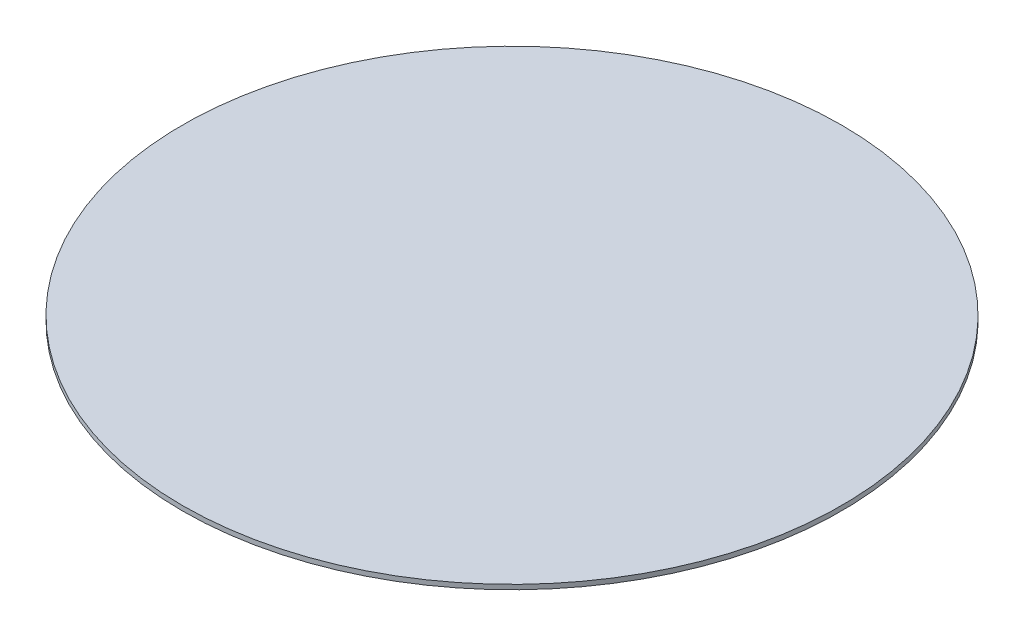
ISO-10303-21;
HEADER;
FILE_DESCRIPTION(('STEP AP214'),'2;1');
FILE_NAME('part.step','',(''),(''),'','','');
FILE_SCHEMA(('AUTOMOTIVE_DESIGN { 1 0 10303 214 1 1 1 1 }'));
ENDSEC;
DATA;
#1=APPLICATION_CONTEXT('core data for automotive mechanical design processes');
#2=APPLICATION_PROTOCOL_DEFINITION('international standard','automotive_design',2000,#1);
#3=PRODUCT_CONTEXT('',#1,'mechanical');
#4=PRODUCT('Part','Part','',(#3));
#5=PRODUCT_RELATED_PRODUCT_CATEGORY('part','',(#4));
#6=PRODUCT_DEFINITION_FORMATION('','',#4);
#7=PRODUCT_DEFINITION_CONTEXT('part definition',#1,'design');
#8=PRODUCT_DEFINITION('design','',#6,#7);
#9=PRODUCT_DEFINITION_SHAPE('','',#8);
#10=(LENGTH_UNIT() NAMED_UNIT(*) SI_UNIT(.MILLI.,.METRE.));
#11=(NAMED_UNIT(*) PLANE_ANGLE_UNIT() SI_UNIT($,.RADIAN.));
#12=(NAMED_UNIT(*) SI_UNIT($,.STERADIAN.) SOLID_ANGLE_UNIT());
#13=UNCERTAINTY_MEASURE_WITH_UNIT(LENGTH_MEASURE(1.E-05),#10,'distance_accuracy_value','');
#14=(GEOMETRIC_REPRESENTATION_CONTEXT(3) GLOBAL_UNCERTAINTY_ASSIGNED_CONTEXT((#13)) GLOBAL_UNIT_ASSIGNED_CONTEXT((#10,
#11,#12)) REPRESENTATION_CONTEXT('',''));
#15=CARTESIAN_POINT('',(0.,0.,0.));
#16=DIRECTION('',(0.,0.,1.));
#17=DIRECTION('',(1.,0.,0.));
#18=AXIS2_PLACEMENT_3D('',#15,#16,#17);
#19=CARTESIAN_POINT('',(0.,0.5,0.));
#20=DIRECTION('',(0.,-1.,0.));
#21=DIRECTION('',(0.,0.,-1.));
#22=AXIS2_PLACEMENT_3D('',#19,#20,#21);
#23=CYLINDRICAL_SURFACE('',#22,35.);
#24=CARTESIAN_POINT('',(0.,0.5,0.));
#25=DIRECTION('',(0.,1.,0.));
#26=DIRECTION('',(0.,0.,1.));
#27=AXIS2_PLACEMENT_3D('',#24,#25,#26);
#28=CIRCLE('',#27,35.);
#29=CARTESIAN_POINT('',(0.,0.5,35.));
#30=VERTEX_POINT('',#29);
#31=EDGE_CURVE('E10',#30,#30,#28,.T.);
#32=ORIENTED_EDGE('',*,*,#31,.F.);
#33=EDGE_LOOP('',(#32));
#34=FACE_BOUND('',#33,.T.);
#35=CARTESIAN_POINT('',(0.,0.,0.));
#36=DIRECTION('',(0.,1.,0.));
#37=DIRECTION('',(0.,0.,1.));
#38=AXIS2_PLACEMENT_3D('',#35,#36,#37);
#39=CIRCLE('',#38,35.);
#40=CARTESIAN_POINT('',(0.,0.,35.));
#41=VERTEX_POINT('',#40);
#42=EDGE_CURVE('E34',#41,#41,#39,.T.);
#43=ORIENTED_EDGE('',*,*,#42,.T.);
#44=EDGE_LOOP('',(#43));
#45=FACE_BOUND('',#44,.T.);
#46=ADVANCED_FACE('F31',(#34,#45),#23,.T.);
#47=CARTESIAN_POINT('',(0.,0.5,0.));
#48=DIRECTION('',(0.,1.,0.));
#49=DIRECTION('',(0.,0.,1.));
#50=AXIS2_PLACEMENT_3D('',#47,#48,#49);
#51=PLANE('',#50);
#52=ORIENTED_EDGE('',*,*,#31,.T.);
#53=EDGE_LOOP('',(#52));
#54=FACE_BOUND('',#53,.T.);
#55=ADVANCED_FACE('F46',(#54),#51,.T.);
#56=CARTESIAN_POINT('',(0.,0.,0.));
#57=DIRECTION('',(0.,1.,0.));
#58=DIRECTION('',(0.,0.,1.));
#59=AXIS2_PLACEMENT_3D('',#56,#57,#58);
#60=PLANE('',#59);
#61=ORIENTED_EDGE('',*,*,#42,.F.);
#62=EDGE_LOOP('',(#61));
#63=FACE_BOUND('',#62,.T.);
#64=ADVANCED_FACE('F44',(#63),#60,.F.);
#65=CLOSED_SHELL('',(#46,#55,#64));
#66=MANIFOLD_SOLID_BREP('B2',#65);
#67=ADVANCED_BREP_SHAPE_REPRESENTATION('',(#18,#66),#14);
#68=SHAPE_DEFINITION_REPRESENTATION(#9,#67);
ENDSEC;
END-ISO-10303-21;
